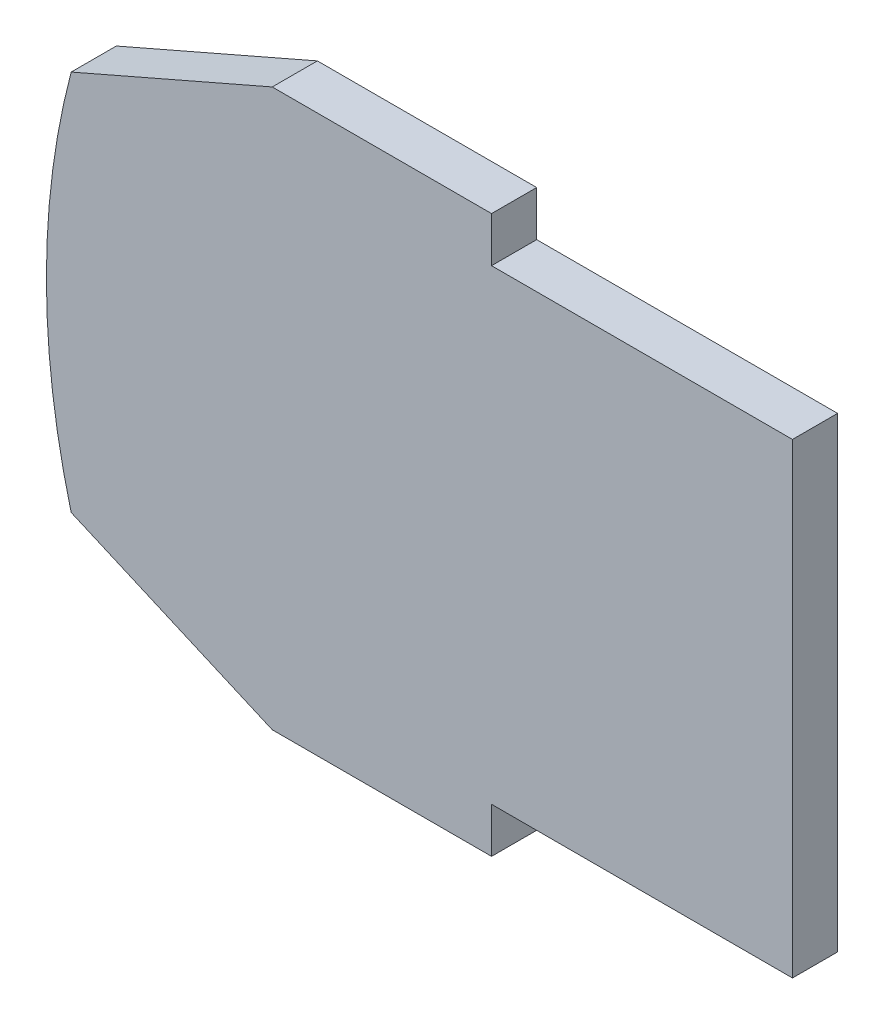
ISO-10303-21;
HEADER;
FILE_DESCRIPTION(('STEP AP214'),'2;1');
FILE_NAME('part.step','',(''),(''),'','','');
FILE_SCHEMA(('AUTOMOTIVE_DESIGN { 1 0 10303 214 1 1 1 1 }'));
ENDSEC;
DATA;
#1=APPLICATION_CONTEXT('core data for automotive mechanical design processes');
#2=APPLICATION_PROTOCOL_DEFINITION('international standard','automotive_design',2000,#1);
#3=PRODUCT_CONTEXT('',#1,'mechanical');
#4=PRODUCT('Part','Part','',(#3));
#5=PRODUCT_RELATED_PRODUCT_CATEGORY('part','',(#4));
#6=PRODUCT_DEFINITION_FORMATION('','',#4);
#7=PRODUCT_DEFINITION_CONTEXT('part definition',#1,'design');
#8=PRODUCT_DEFINITION('design','',#6,#7);
#9=PRODUCT_DEFINITION_SHAPE('','',#8);
#10=(LENGTH_UNIT() NAMED_UNIT(*) SI_UNIT(.MILLI.,.METRE.));
#11=(NAMED_UNIT(*) PLANE_ANGLE_UNIT() SI_UNIT($,.RADIAN.));
#12=(NAMED_UNIT(*) SI_UNIT($,.STERADIAN.) SOLID_ANGLE_UNIT());
#13=UNCERTAINTY_MEASURE_WITH_UNIT(LENGTH_MEASURE(1.E-05),#10,'distance_accuracy_value','');
#14=(GEOMETRIC_REPRESENTATION_CONTEXT(3) GLOBAL_UNCERTAINTY_ASSIGNED_CONTEXT((#13)) GLOBAL_UNIT_ASSIGNED_CONTEXT((#10,
#11,#12)) REPRESENTATION_CONTEXT('',''));
#15=CARTESIAN_POINT('',(0.,0.,0.));
#16=DIRECTION('',(0.,0.,1.));
#17=DIRECTION('',(1.,0.,0.));
#18=AXIS2_PLACEMENT_3D('',#15,#16,#17);
#19=CARTESIAN_POINT('',(570.053994223381,-55.2278795582131,2.99999999999998));
#20=DIRECTION('',(-1.,0.,0.));
#21=DIRECTION('',(0.,0.,1.));
#22=AXIS2_PLACEMENT_3D('',#19,#20,#21);
#23=PLANE('',#22);
#24=DIRECTION('',(0.,1.,0.));
#25=VECTOR('',#24,1.);
#26=CARTESIAN_POINT('',(570.053994223381,-55.2278795582131,0.));
#27=LINE('',#26,#25);
#28=CARTESIAN_POINT('',(570.053994223381,-55.2278795582131,0.));
#29=VERTEX_POINT('',#28);
#30=CARTESIAN_POINT('',(570.053994223381,-52.2278795582131,0.));
#31=VERTEX_POINT('',#30);
#32=EDGE_CURVE('E112',#29,#31,#27,.T.);
#33=ORIENTED_EDGE('',*,*,#32,.T.);
#34=DIRECTION('',(0.,0.,-1.));
#35=VECTOR('',#34,1.);
#36=CARTESIAN_POINT('',(570.053994223381,-52.2278795582131,2.99999999999999));
#37=LINE('',#36,#35);
#38=CARTESIAN_POINT('',(570.053994223381,-52.2278795582131,2.99999999999999));
#39=VERTEX_POINT('',#38);
#40=EDGE_CURVE('E11',#39,#31,#37,.T.);
#41=ORIENTED_EDGE('',*,*,#40,.F.);
#42=DIRECTION('',(0.,1.,0.));
#43=VECTOR('',#42,1.);
#44=CARTESIAN_POINT('',(570.053994223381,-55.2278795582131,2.99999999999998));
#45=LINE('',#44,#43);
#46=CARTESIAN_POINT('',(570.053994223381,-55.2278795582131,2.99999999999998));
#47=VERTEX_POINT('',#46);
#48=EDGE_CURVE('E144',#47,#39,#45,.T.);
#49=ORIENTED_EDGE('',*,*,#48,.F.);
#50=DIRECTION('',(0.,0.,-1.));
#51=VECTOR('',#50,1.);
#52=CARTESIAN_POINT('',(570.053994223381,-55.2278795582131,2.99999999999998));
#53=LINE('',#52,#51);
#54=EDGE_CURVE('E125',#47,#29,#53,.T.);
#55=ORIENTED_EDGE('',*,*,#54,.T.);
#56=EDGE_LOOP('',(#33,#41,#49,#55));
#57=FACE_BOUND('',#56,.T.);
#58=ADVANCED_FACE('F32',(#57),#23,.F.);
#59=CARTESIAN_POINT('',(570.053994223381,-52.2278795582131,2.99999999999999));
#60=DIRECTION('',(0.,-1.,0.));
#61=DIRECTION('',(0.,0.,-1.));
#62=AXIS2_PLACEMENT_3D('',#59,#60,#61);
#63=PLANE('',#62);
#64=DIRECTION('',(-1.,0.,0.));
#65=VECTOR('',#64,1.);
#66=CARTESIAN_POINT('',(570.053994223381,-52.2278795582131,0.));
#67=LINE('',#66,#65);
#68=CARTESIAN_POINT('',(555.477414106064,-52.2278795582131,0.));
#69=VERTEX_POINT('',#68);
#70=EDGE_CURVE('E108',#31,#69,#67,.T.);
#71=ORIENTED_EDGE('',*,*,#70,.T.);
#72=DIRECTION('',(0.,0.,-1.));
#73=VECTOR('',#72,1.);
#74=CARTESIAN_POINT('',(555.477414106064,-52.2278795582131,3.));
#75=LINE('',#74,#73);
#76=CARTESIAN_POINT('',(555.477414106064,-52.2278795582131,3.));
#77=VERTEX_POINT('',#76);
#78=EDGE_CURVE('E39',#77,#69,#75,.T.);
#79=ORIENTED_EDGE('',*,*,#78,.F.);
#80=DIRECTION('',(-1.,0.,0.));
#81=VECTOR('',#80,1.);
#82=CARTESIAN_POINT('',(570.053994223381,-52.2278795582131,2.99999999999999));
#83=LINE('',#82,#81);
#84=EDGE_CURVE('E121',#39,#77,#83,.T.);
#85=ORIENTED_EDGE('',*,*,#84,.F.);
#86=ORIENTED_EDGE('',*,*,#40,.T.);
#87=EDGE_LOOP('',(#71,#79,#85,#86));
#88=FACE_BOUND('',#87,.T.);
#89=ADVANCED_FACE('F120',(#88),#63,.F.);
#90=CARTESIAN_POINT('',(555.477414106064,-52.2278795582131,3.));
#91=DIRECTION('',(0.399550585762696,-0.916711148299554,0.));
#92=DIRECTION('',(0.916711148299554,0.399550585762696,0.));
#93=AXIS2_PLACEMENT_3D('',#90,#91,#92);
#94=PLANE('',#93);
#95=DIRECTION('',(-0.916711148299554,-0.399550585762697,0.));
#96=VECTOR('',#95,1.);
#97=CARTESIAN_POINT('',(555.477414106064,-52.2278795582131,0.));
#98=LINE('',#97,#96);
#99=CARTESIAN_POINT('',(542.114900608437,-58.0519606825041,0.));
#100=VERTEX_POINT('',#99);
#101=EDGE_CURVE('E114',#69,#100,#98,.T.);
#102=ORIENTED_EDGE('',*,*,#101,.T.);
#103=DIRECTION('',(0.,0.,-1.));
#104=VECTOR('',#103,1.);
#105=CARTESIAN_POINT('',(542.114900608437,-58.0519606825041,3.00000000000002));
#106=LINE('',#105,#104);
#107=CARTESIAN_POINT('',(542.114900608437,-58.0519606825041,3.00000000000002));
#108=VERTEX_POINT('',#107);
#109=EDGE_CURVE('E180',#108,#100,#106,.T.);
#110=ORIENTED_EDGE('',*,*,#109,.F.);
#111=DIRECTION('',(-0.916711148299554,-0.399550585762697,0.));
#112=VECTOR('',#111,1.);
#113=CARTESIAN_POINT('',(555.477414106064,-52.2278795582131,3.));
#114=LINE('',#113,#112);
#115=EDGE_CURVE('E147',#77,#108,#114,.T.);
#116=ORIENTED_EDGE('',*,*,#115,.F.);
#117=ORIENTED_EDGE('',*,*,#78,.T.);
#118=EDGE_LOOP('',(#102,#110,#116,#117));
#119=FACE_BOUND('',#118,.T.);
#120=ADVANCED_FACE('F184',(#119),#94,.F.);
#121=CARTESIAN_POINT('',(590.053994223381,-70.7276231160368,3.00000000000003));
#122=DIRECTION('',(0.,0.,-1.));
#123=DIRECTION('',(-1.,0.,0.));
#124=AXIS2_PLACEMENT_3D('',#121,#122,#123);
#125=CYLINDRICAL_SURFACE('',#124,49.5865820031106);
#126=CARTESIAN_POINT('',(590.053994223381,-70.7276231160368,0.));
#127=DIRECTION('',(0.,0.,1.));
#128=DIRECTION('',(1.,0.,0.));
#129=AXIS2_PLACEMENT_3D('',#126,#127,#128);
#130=CIRCLE('',#129,49.5865820031106);
#131=CARTESIAN_POINT('',(542.114985016635,-83.403604775328,0.));
#132=VERTEX_POINT('',#131);
#133=EDGE_CURVE('E129',#100,#132,#130,.T.);
#134=ORIENTED_EDGE('',*,*,#133,.T.);
#135=DIRECTION('',(0.,0.,-1.));
#136=VECTOR('',#135,1.);
#137=CARTESIAN_POINT('',(542.114985016635,-83.403604775328,3.00000000000007));
#138=LINE('',#137,#136);
#139=CARTESIAN_POINT('',(542.114985016635,-83.403604775328,3.00000000000007));
#140=VERTEX_POINT('',#139);
#141=EDGE_CURVE('E177',#140,#132,#138,.T.);
#142=ORIENTED_EDGE('',*,*,#141,.F.);
#143=CARTESIAN_POINT('',(590.053994223381,-70.7276231160368,3.00000000000003));
#144=DIRECTION('',(0.,0.,1.));
#145=DIRECTION('',(1.,0.,0.));
#146=AXIS2_PLACEMENT_3D('',#143,#144,#145);
#147=CIRCLE('',#146,49.5865820031106);
#148=EDGE_CURVE('E149',#108,#140,#147,.T.);
#149=ORIENTED_EDGE('',*,*,#148,.F.);
#150=ORIENTED_EDGE('',*,*,#109,.T.);
#151=EDGE_LOOP('',(#134,#142,#149,#150));
#152=FACE_BOUND('',#151,.T.);
#153=ADVANCED_FACE('F192',(#152),#125,.T.);
#154=CARTESIAN_POINT('',(555.477414106064,-89.2278795582131,2.99999999999999));
#155=DIRECTION('',(0.39956387136141,0.916705357627348,0.));
#156=DIRECTION('',(-0.916705357627347,0.399563871361411,0.));
#157=AXIS2_PLACEMENT_3D('',#154,#155,#156);
#158=PLANE('',#157);
#159=DIRECTION('',(0.916705357627347,-0.399563871361411,0.));
#160=VECTOR('',#159,1.);
#161=CARTESIAN_POINT('',(555.477414106064,-89.2278795582131,0.));
#162=LINE('',#161,#160);
#163=CARTESIAN_POINT('',(555.477414106064,-89.2278795582131,0.));
#164=VERTEX_POINT('',#163);
#165=EDGE_CURVE('E131',#132,#164,#162,.T.);
#166=ORIENTED_EDGE('',*,*,#165,.T.);
#167=DIRECTION('',(0.,0.,-1.));
#168=VECTOR('',#167,1.);
#169=CARTESIAN_POINT('',(555.477414106064,-89.2278795582131,2.99999999999999));
#170=LINE('',#169,#168);
#171=CARTESIAN_POINT('',(555.477414106064,-89.2278795582131,2.99999999999999));
#172=VERTEX_POINT('',#171);
#173=EDGE_CURVE('E174',#172,#164,#170,.T.);
#174=ORIENTED_EDGE('',*,*,#173,.F.);
#175=DIRECTION('',(0.916705357627347,-0.399563871361411,0.));
#176=VECTOR('',#175,1.);
#177=CARTESIAN_POINT('',(555.477414106064,-89.2278795582131,2.99999999999999));
#178=LINE('',#177,#176);
#179=EDGE_CURVE('E151',#140,#172,#178,.T.);
#180=ORIENTED_EDGE('',*,*,#179,.F.);
#181=ORIENTED_EDGE('',*,*,#141,.T.);
#182=EDGE_LOOP('',(#166,#174,#180,#181));
#183=FACE_BOUND('',#182,.T.);
#184=ADVANCED_FACE('F195',(#183),#158,.F.);
#185=CARTESIAN_POINT('',(570.053994223381,-89.2278795582131,3.));
#186=DIRECTION('',(0.,1.,0.));
#187=DIRECTION('',(0.,0.,1.));
#188=AXIS2_PLACEMENT_3D('',#185,#186,#187);
#189=PLANE('',#188);
#190=DIRECTION('',(1.,0.,0.));
#191=VECTOR('',#190,1.);
#192=CARTESIAN_POINT('',(570.053994223381,-89.2278795582131,0.));
#193=LINE('',#192,#191);
#194=CARTESIAN_POINT('',(570.053994223381,-89.2278795582131,0.));
#195=VERTEX_POINT('',#194);
#196=EDGE_CURVE('E133',#164,#195,#193,.T.);
#197=ORIENTED_EDGE('',*,*,#196,.T.);
#198=DIRECTION('',(0.,0.,-1.));
#199=VECTOR('',#198,1.);
#200=CARTESIAN_POINT('',(570.053994223381,-89.2278795582131,3.));
#201=LINE('',#200,#199);
#202=CARTESIAN_POINT('',(570.053994223381,-89.2278795582131,3.));
#203=VERTEX_POINT('',#202);
#204=EDGE_CURVE('E171',#203,#195,#201,.T.);
#205=ORIENTED_EDGE('',*,*,#204,.F.);
#206=DIRECTION('',(1.,0.,0.));
#207=VECTOR('',#206,1.);
#208=CARTESIAN_POINT('',(570.053994223381,-89.2278795582131,3.));
#209=LINE('',#208,#207);
#210=EDGE_CURVE('E153',#172,#203,#209,.T.);
#211=ORIENTED_EDGE('',*,*,#210,.F.);
#212=ORIENTED_EDGE('',*,*,#173,.T.);
#213=EDGE_LOOP('',(#197,#205,#211,#212));
#214=FACE_BOUND('',#213,.T.);
#215=ADVANCED_FACE('F200',(#214),#189,.F.);
#216=CARTESIAN_POINT('',(570.053994223381,-86.2278795582131,3.));
#217=DIRECTION('',(-1.,0.,0.));
#218=DIRECTION('',(0.,-1.,0.));
#219=AXIS2_PLACEMENT_3D('',#216,#217,#218);
#220=PLANE('',#219);
#221=DIRECTION('',(0.,1.,0.));
#222=VECTOR('',#221,1.);
#223=CARTESIAN_POINT('',(570.053994223381,-86.2278795582131,0.));
#224=LINE('',#223,#222);
#225=CARTESIAN_POINT('',(570.053994223381,-86.2278795582131,0.));
#226=VERTEX_POINT('',#225);
#227=EDGE_CURVE('E135',#195,#226,#224,.T.);
#228=ORIENTED_EDGE('',*,*,#227,.T.);
#229=DIRECTION('',(0.,0.,-1.));
#230=VECTOR('',#229,1.);
#231=CARTESIAN_POINT('',(570.053994223381,-86.2278795582131,3.));
#232=LINE('',#231,#230);
#233=CARTESIAN_POINT('',(570.053994223381,-86.2278795582131,3.));
#234=VERTEX_POINT('',#233);
#235=EDGE_CURVE('E168',#234,#226,#232,.T.);
#236=ORIENTED_EDGE('',*,*,#235,.F.);
#237=DIRECTION('',(0.,1.,0.));
#238=VECTOR('',#237,1.);
#239=CARTESIAN_POINT('',(570.053994223381,-86.2278795582131,3.));
#240=LINE('',#239,#238);
#241=EDGE_CURVE('E155',#203,#234,#240,.T.);
#242=ORIENTED_EDGE('',*,*,#241,.F.);
#243=ORIENTED_EDGE('',*,*,#204,.T.);
#244=EDGE_LOOP('',(#228,#236,#242,#243));
#245=FACE_BOUND('',#244,.T.);
#246=ADVANCED_FACE('F206',(#245),#220,.F.);
#247=CARTESIAN_POINT('',(590.053994223381,-86.2278795582131,3.));
#248=DIRECTION('',(0.,1.,0.));
#249=DIRECTION('',(0.,0.,1.));
#250=AXIS2_PLACEMENT_3D('',#247,#248,#249);
#251=PLANE('',#250);
#252=DIRECTION('',(1.,0.,0.));
#253=VECTOR('',#252,1.);
#254=CARTESIAN_POINT('',(590.053994223381,-86.2278795582131,0.));
#255=LINE('',#254,#253);
#256=CARTESIAN_POINT('',(590.053994223381,-86.2278795582131,0.));
#257=VERTEX_POINT('',#256);
#258=EDGE_CURVE('E137',#226,#257,#255,.T.);
#259=ORIENTED_EDGE('',*,*,#258,.T.);
#260=DIRECTION('',(0.,0.,-1.));
#261=VECTOR('',#260,1.);
#262=CARTESIAN_POINT('',(590.053994223381,-86.2278795582131,3.));
#263=LINE('',#262,#261);
#264=CARTESIAN_POINT('',(590.053994223381,-86.2278795582131,3.));
#265=VERTEX_POINT('',#264);
#266=EDGE_CURVE('E165',#265,#257,#263,.T.);
#267=ORIENTED_EDGE('',*,*,#266,.F.);
#268=DIRECTION('',(1.,0.,0.));
#269=VECTOR('',#268,1.);
#270=CARTESIAN_POINT('',(590.053994223381,-86.2278795582131,3.));
#271=LINE('',#270,#269);
#272=EDGE_CURVE('E157',#234,#265,#271,.T.);
#273=ORIENTED_EDGE('',*,*,#272,.F.);
#274=ORIENTED_EDGE('',*,*,#235,.T.);
#275=EDGE_LOOP('',(#259,#267,#273,#274));
#276=FACE_BOUND('',#275,.T.);
#277=ADVANCED_FACE('F210',(#276),#251,.F.);
#278=CARTESIAN_POINT('',(590.053994223381,-70.7276231160368,3.00000000000003));
#279=DIRECTION('',(-1.,0.,0.));
#280=DIRECTION('',(0.,0.,1.));
#281=AXIS2_PLACEMENT_3D('',#278,#279,#280);
#282=PLANE('',#281);
#283=DIRECTION('',(0.,1.,0.));
#284=VECTOR('',#283,1.);
#285=CARTESIAN_POINT('',(590.053994223381,-70.7276231160368,0.));
#286=LINE('',#285,#284);
#287=CARTESIAN_POINT('',(590.053994223381,-55.2278795582131,0.));
#288=VERTEX_POINT('',#287);
#289=EDGE_CURVE('E140',#257,#288,#286,.T.);
#290=ORIENTED_EDGE('',*,*,#289,.T.);
#291=DIRECTION('',(0.,0.,-1.));
#292=VECTOR('',#291,1.);
#293=CARTESIAN_POINT('',(590.053994223381,-55.2278795582131,2.99999999999999));
#294=LINE('',#293,#292);
#295=CARTESIAN_POINT('',(590.053994223381,-55.2278795582131,2.99999999999999));
#296=VERTEX_POINT('',#295);
#297=EDGE_CURVE('E162',#296,#288,#294,.T.);
#298=ORIENTED_EDGE('',*,*,#297,.F.);
#299=DIRECTION('',(0.,1.,0.));
#300=VECTOR('',#299,1.);
#301=CARTESIAN_POINT('',(590.053994223381,-70.7276231160368,3.00000000000003));
#302=LINE('',#301,#300);
#303=EDGE_CURVE('E51',#265,#296,#302,.T.);
#304=ORIENTED_EDGE('',*,*,#303,.F.);
#305=ORIENTED_EDGE('',*,*,#266,.T.);
#306=EDGE_LOOP('',(#290,#298,#304,#305));
#307=FACE_BOUND('',#306,.T.);
#308=ADVANCED_FACE('F212',(#307),#282,.F.);
#309=CARTESIAN_POINT('',(590.053994223381,-55.2278795582131,2.99999999999999));
#310=DIRECTION('',(0.,-1.,0.));
#311=DIRECTION('',(0.,0.,-1.));
#312=AXIS2_PLACEMENT_3D('',#309,#310,#311);
#313=PLANE('',#312);
#314=DIRECTION('',(-1.,0.,0.));
#315=VECTOR('',#314,1.);
#316=CARTESIAN_POINT('',(590.053994223381,-55.2278795582131,0.));
#317=LINE('',#316,#315);
#318=EDGE_CURVE('E142',#288,#29,#317,.T.);
#319=ORIENTED_EDGE('',*,*,#318,.T.);
#320=ORIENTED_EDGE('',*,*,#54,.F.);
#321=DIRECTION('',(-1.,0.,0.));
#322=VECTOR('',#321,1.);
#323=CARTESIAN_POINT('',(590.053994223381,-55.2278795582131,2.99999999999999));
#324=LINE('',#323,#322);
#325=EDGE_CURVE('E46',#296,#47,#324,.T.);
#326=ORIENTED_EDGE('',*,*,#325,.F.);
#327=ORIENTED_EDGE('',*,*,#297,.T.);
#328=EDGE_LOOP('',(#319,#320,#326,#327));
#329=FACE_BOUND('',#328,.T.);
#330=ADVANCED_FACE('F214',(#329),#313,.F.);
#331=CARTESIAN_POINT('',(590.053994223381,-70.7276231160368,3.00000000000003));
#332=DIRECTION('',(0.,0.,1.));
#333=DIRECTION('',(1.,0.,0.));
#334=AXIS2_PLACEMENT_3D('',#331,#332,#333);
#335=PLANE('',#334);
#336=ORIENTED_EDGE('',*,*,#48,.T.);
#337=ORIENTED_EDGE('',*,*,#84,.T.);
#338=ORIENTED_EDGE('',*,*,#115,.T.);
#339=ORIENTED_EDGE('',*,*,#148,.T.);
#340=ORIENTED_EDGE('',*,*,#179,.T.);
#341=ORIENTED_EDGE('',*,*,#210,.T.);
#342=ORIENTED_EDGE('',*,*,#241,.T.);
#343=ORIENTED_EDGE('',*,*,#272,.T.);
#344=ORIENTED_EDGE('',*,*,#303,.T.);
#345=ORIENTED_EDGE('',*,*,#325,.T.);
#346=EDGE_LOOP('',(#336,#337,#338,#339,#340,#341,#342,#343,#344,#345));
#347=FACE_BOUND('',#346,.T.);
#348=ADVANCED_FACE('F187',(#347),#335,.T.);
#349=CARTESIAN_POINT('',(590.053994223381,-70.7276231160368,0.));
#350=DIRECTION('',(0.,0.,1.));
#351=DIRECTION('',(1.,0.,0.));
#352=AXIS2_PLACEMENT_3D('',#349,#350,#351);
#353=PLANE('',#352);
#354=ORIENTED_EDGE('',*,*,#32,.F.);
#355=ORIENTED_EDGE('',*,*,#318,.F.);
#356=ORIENTED_EDGE('',*,*,#289,.F.);
#357=ORIENTED_EDGE('',*,*,#258,.F.);
#358=ORIENTED_EDGE('',*,*,#227,.F.);
#359=ORIENTED_EDGE('',*,*,#196,.F.);
#360=ORIENTED_EDGE('',*,*,#165,.F.);
#361=ORIENTED_EDGE('',*,*,#133,.F.);
#362=ORIENTED_EDGE('',*,*,#101,.F.);
#363=ORIENTED_EDGE('',*,*,#70,.F.);
#364=EDGE_LOOP('',(#354,#355,#356,#357,#358,#359,#360,#361,#362,#363));
#365=FACE_BOUND('',#364,.T.);
#366=ADVANCED_FACE('F109',(#365),#353,.F.);
#367=CLOSED_SHELL('',(#58,#89,#120,#153,#184,#215,#246,#277,#308,#330,#348,#366));
#368=MANIFOLD_SOLID_BREP('B2',#367);
#369=ADVANCED_BREP_SHAPE_REPRESENTATION('',(#18,#368),#14);
#370=SHAPE_DEFINITION_REPRESENTATION(#9,#369);
ENDSEC;
END-ISO-10303-21;
